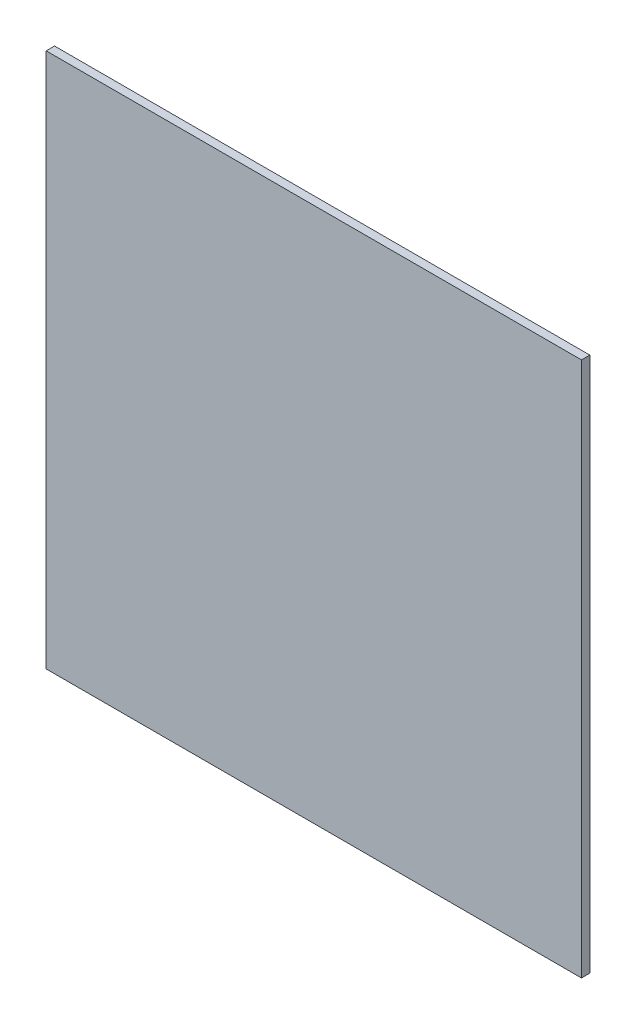
ISO-10303-21;
HEADER;
FILE_DESCRIPTION(('STEP AP214'),'2;1');
FILE_NAME('part.step','',(''),(''),'','','');
FILE_SCHEMA(('AUTOMOTIVE_DESIGN { 1 0 10303 214 1 1 1 1 }'));
ENDSEC;
DATA;
#1=APPLICATION_CONTEXT('core data for automotive mechanical design processes');
#2=APPLICATION_PROTOCOL_DEFINITION('international standard','automotive_design',2000,#1);
#3=PRODUCT_CONTEXT('',#1,'mechanical');
#4=PRODUCT('Part','Part','',(#3));
#5=PRODUCT_RELATED_PRODUCT_CATEGORY('part','',(#4));
#6=PRODUCT_DEFINITION_FORMATION('','',#4);
#7=PRODUCT_DEFINITION_CONTEXT('part definition',#1,'design');
#8=PRODUCT_DEFINITION('design','',#6,#7);
#9=PRODUCT_DEFINITION_SHAPE('','',#8);
#10=(LENGTH_UNIT() NAMED_UNIT(*) SI_UNIT(.MILLI.,.METRE.));
#11=(NAMED_UNIT(*) PLANE_ANGLE_UNIT() SI_UNIT($,.RADIAN.));
#12=(NAMED_UNIT(*) SI_UNIT($,.STERADIAN.) SOLID_ANGLE_UNIT());
#13=UNCERTAINTY_MEASURE_WITH_UNIT(LENGTH_MEASURE(1.E-05),#10,'distance_accuracy_value','');
#14=(GEOMETRIC_REPRESENTATION_CONTEXT(3) GLOBAL_UNCERTAINTY_ASSIGNED_CONTEXT((#13)) GLOBAL_UNIT_ASSIGNED_CONTEXT((#10,
#11,#12)) REPRESENTATION_CONTEXT('',''));
#15=CARTESIAN_POINT('',(0.,0.,0.));
#16=DIRECTION('',(0.,0.,1.));
#17=DIRECTION('',(1.,0.,0.));
#18=AXIS2_PLACEMENT_3D('',#15,#16,#17);
#19=CARTESIAN_POINT('',(609.6,609.6,19.05));
#20=DIRECTION('',(-1.,0.,0.));
#21=DIRECTION('',(0.,0.,1.));
#22=AXIS2_PLACEMENT_3D('',#19,#20,#21);
#23=PLANE('',#22);
#24=DIRECTION('',(0.,1.,0.));
#25=VECTOR('',#24,1.);
#26=CARTESIAN_POINT('',(609.6,609.6,0.));
#27=LINE('',#26,#25);
#28=CARTESIAN_POINT('',(609.6,-609.6,0.));
#29=VERTEX_POINT('',#28);
#30=CARTESIAN_POINT('',(609.6,609.6,0.));
#31=VERTEX_POINT('',#30);
#32=EDGE_CURVE('E113',#29,#31,#27,.T.);
#33=ORIENTED_EDGE('',*,*,#32,.T.);
#34=DIRECTION('',(0.,0.,-1.));
#35=VECTOR('',#34,1.);
#36=CARTESIAN_POINT('',(609.6,609.6,19.05));
#37=LINE('',#36,#35);
#38=CARTESIAN_POINT('',(609.6,609.6,19.05));
#39=VERTEX_POINT('',#38);
#40=EDGE_CURVE('E11',#39,#31,#37,.T.);
#41=ORIENTED_EDGE('',*,*,#40,.F.);
#42=DIRECTION('',(0.,1.,0.));
#43=VECTOR('',#42,1.);
#44=CARTESIAN_POINT('',(609.6,609.6,19.05));
#45=LINE('',#44,#43);
#46=CARTESIAN_POINT('',(609.6,-609.6,19.05));
#47=VERTEX_POINT('',#46);
#48=EDGE_CURVE('E97',#47,#39,#45,.T.);
#49=ORIENTED_EDGE('',*,*,#48,.F.);
#50=DIRECTION('',(0.,0.,-1.));
#51=VECTOR('',#50,1.);
#52=CARTESIAN_POINT('',(609.6,-609.6,19.05));
#53=LINE('',#52,#51);
#54=EDGE_CURVE('E109',#47,#29,#53,.T.);
#55=ORIENTED_EDGE('',*,*,#54,.T.);
#56=EDGE_LOOP('',(#33,#41,#49,#55));
#57=FACE_BOUND('',#56,.T.);
#58=ADVANCED_FACE('F45',(#57),#23,.F.);
#59=CARTESIAN_POINT('',(-609.6,609.6,19.05));
#60=DIRECTION('',(0.,-1.,0.));
#61=DIRECTION('',(0.,0.,-1.));
#62=AXIS2_PLACEMENT_3D('',#59,#60,#61);
#63=PLANE('',#62);
#64=DIRECTION('',(-1.,0.,0.));
#65=VECTOR('',#64,1.);
#66=CARTESIAN_POINT('',(-609.6,609.6,0.));
#67=LINE('',#66,#65);
#68=CARTESIAN_POINT('',(-609.6,609.6,0.));
#69=VERTEX_POINT('',#68);
#70=EDGE_CURVE('E102',#31,#69,#67,.T.);
#71=ORIENTED_EDGE('',*,*,#70,.T.);
#72=DIRECTION('',(0.,0.,-1.));
#73=VECTOR('',#72,1.);
#74=CARTESIAN_POINT('',(-609.6,609.6,19.05));
#75=LINE('',#74,#73);
#76=CARTESIAN_POINT('',(-609.6,609.6,19.05));
#77=VERTEX_POINT('',#76);
#78=EDGE_CURVE('E54',#77,#69,#75,.T.);
#79=ORIENTED_EDGE('',*,*,#78,.F.);
#80=DIRECTION('',(-1.,0.,0.));
#81=VECTOR('',#80,1.);
#82=CARTESIAN_POINT('',(-609.6,609.6,19.05));
#83=LINE('',#82,#81);
#84=EDGE_CURVE('E92',#39,#77,#83,.T.);
#85=ORIENTED_EDGE('',*,*,#84,.F.);
#86=ORIENTED_EDGE('',*,*,#40,.T.);
#87=EDGE_LOOP('',(#71,#79,#85,#86));
#88=FACE_BOUND('',#87,.T.);
#89=ADVANCED_FACE('F101',(#88),#63,.F.);
#90=CARTESIAN_POINT('',(-609.6,609.6,19.05));
#91=DIRECTION('',(1.,0.,0.));
#92=DIRECTION('',(0.,1.,0.));
#93=AXIS2_PLACEMENT_3D('',#90,#91,#92);
#94=PLANE('',#93);
#95=DIRECTION('',(0.,-1.,0.));
#96=VECTOR('',#95,1.);
#97=CARTESIAN_POINT('',(-609.6,609.6,0.));
#98=LINE('',#97,#96);
#99=CARTESIAN_POINT('',(-609.6,-609.6,0.));
#100=VERTEX_POINT('',#99);
#101=EDGE_CURVE('E79',#69,#100,#98,.T.);
#102=ORIENTED_EDGE('',*,*,#101,.T.);
#103=DIRECTION('',(0.,0.,-1.));
#104=VECTOR('',#103,1.);
#105=CARTESIAN_POINT('',(-609.6,-609.6,19.05));
#106=LINE('',#105,#104);
#107=CARTESIAN_POINT('',(-609.6,-609.6,19.05));
#108=VERTEX_POINT('',#107);
#109=EDGE_CURVE('E104',#108,#100,#106,.T.);
#110=ORIENTED_EDGE('',*,*,#109,.F.);
#111=DIRECTION('',(0.,-1.,0.));
#112=VECTOR('',#111,1.);
#113=CARTESIAN_POINT('',(-609.6,609.6,19.05));
#114=LINE('',#113,#112);
#115=EDGE_CURVE('E95',#77,#108,#114,.T.);
#116=ORIENTED_EDGE('',*,*,#115,.F.);
#117=ORIENTED_EDGE('',*,*,#78,.T.);
#118=EDGE_LOOP('',(#102,#110,#116,#117));
#119=FACE_BOUND('',#118,.T.);
#120=ADVANCED_FACE('F105',(#119),#94,.F.);
#121=CARTESIAN_POINT('',(-609.6,-609.6,19.05));
#122=DIRECTION('',(0.,1.,0.));
#123=DIRECTION('',(0.,0.,1.));
#124=AXIS2_PLACEMENT_3D('',#121,#122,#123);
#125=PLANE('',#124);
#126=DIRECTION('',(1.,0.,0.));
#127=VECTOR('',#126,1.);
#128=CARTESIAN_POINT('',(-609.6,-609.6,0.));
#129=LINE('',#128,#127);
#130=EDGE_CURVE('E85',#100,#29,#129,.T.);
#131=ORIENTED_EDGE('',*,*,#130,.T.);
#132=ORIENTED_EDGE('',*,*,#54,.F.);
#133=DIRECTION('',(1.,0.,0.));
#134=VECTOR('',#133,1.);
#135=CARTESIAN_POINT('',(-609.6,-609.6,19.05));
#136=LINE('',#135,#134);
#137=EDGE_CURVE('E62',#108,#47,#136,.T.);
#138=ORIENTED_EDGE('',*,*,#137,.F.);
#139=ORIENTED_EDGE('',*,*,#109,.T.);
#140=EDGE_LOOP('',(#131,#132,#138,#139));
#141=FACE_BOUND('',#140,.T.);
#142=ADVANCED_FACE('F126',(#141),#125,.F.);
#143=CARTESIAN_POINT('',(0.,0.,19.05));
#144=DIRECTION('',(0.,0.,1.));
#145=DIRECTION('',(1.,0.,0.));
#146=AXIS2_PLACEMENT_3D('',#143,#144,#145);
#147=PLANE('',#146);
#148=ORIENTED_EDGE('',*,*,#48,.T.);
#149=ORIENTED_EDGE('',*,*,#84,.T.);
#150=ORIENTED_EDGE('',*,*,#115,.T.);
#151=ORIENTED_EDGE('',*,*,#137,.T.);
#152=EDGE_LOOP('',(#148,#149,#150,#151));
#153=FACE_BOUND('',#152,.T.);
#154=ADVANCED_FACE('F93',(#153),#147,.T.);
#155=CARTESIAN_POINT('',(0.,0.,0.));
#156=DIRECTION('',(0.,0.,1.));
#157=DIRECTION('',(1.,0.,0.));
#158=AXIS2_PLACEMENT_3D('',#155,#156,#157);
#159=PLANE('',#158);
#160=ORIENTED_EDGE('',*,*,#32,.F.);
#161=ORIENTED_EDGE('',*,*,#130,.F.);
#162=ORIENTED_EDGE('',*,*,#101,.F.);
#163=ORIENTED_EDGE('',*,*,#70,.F.);
#164=EDGE_LOOP('',(#160,#161,#162,#163));
#165=FACE_BOUND('',#164,.T.);
#166=ADVANCED_FACE('F129',(#165),#159,.F.);
#167=CLOSED_SHELL('',(#58,#89,#120,#142,#154,#166));
#168=MANIFOLD_SOLID_BREP('B2',#167);
#169=ADVANCED_BREP_SHAPE_REPRESENTATION('',(#18,#168),#14);
#170=SHAPE_DEFINITION_REPRESENTATION(#9,#169);
ENDSEC;
END-ISO-10303-21;
